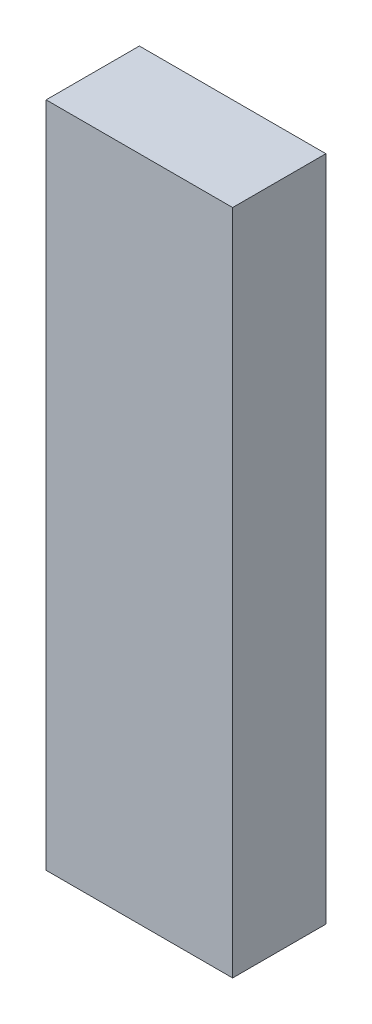
ISO-10303-21;
HEADER;
FILE_DESCRIPTION(('STEP AP214'),'2;1');
FILE_NAME('part.step','',(''),(''),'','','');
FILE_SCHEMA(('AUTOMOTIVE_DESIGN { 1 0 10303 214 1 1 1 1 }'));
ENDSEC;
DATA;
#1=APPLICATION_CONTEXT('core data for automotive mechanical design processes');
#2=APPLICATION_PROTOCOL_DEFINITION('international standard','automotive_design',2000,#1);
#3=PRODUCT_CONTEXT('',#1,'mechanical');
#4=PRODUCT('Part','Part','',(#3));
#5=PRODUCT_RELATED_PRODUCT_CATEGORY('part','',(#4));
#6=PRODUCT_DEFINITION_FORMATION('','',#4);
#7=PRODUCT_DEFINITION_CONTEXT('part definition',#1,'design');
#8=PRODUCT_DEFINITION('design','',#6,#7);
#9=PRODUCT_DEFINITION_SHAPE('','',#8);
#10=(LENGTH_UNIT() NAMED_UNIT(*) SI_UNIT(.MILLI.,.METRE.));
#11=(NAMED_UNIT(*) PLANE_ANGLE_UNIT() SI_UNIT($,.RADIAN.));
#12=(NAMED_UNIT(*) SI_UNIT($,.STERADIAN.) SOLID_ANGLE_UNIT());
#13=UNCERTAINTY_MEASURE_WITH_UNIT(LENGTH_MEASURE(1.E-05),#10,'distance_accuracy_value','');
#14=(GEOMETRIC_REPRESENTATION_CONTEXT(3) GLOBAL_UNCERTAINTY_ASSIGNED_CONTEXT((#13)) GLOBAL_UNIT_ASSIGNED_CONTEXT((#10,
#11,#12)) REPRESENTATION_CONTEXT('',''));
#15=CARTESIAN_POINT('',(0.,0.,0.));
#16=DIRECTION('',(0.,0.,1.));
#17=DIRECTION('',(1.,0.,0.));
#18=AXIS2_PLACEMENT_3D('',#15,#16,#17);
#19=CARTESIAN_POINT('',(-50.8,363.474,-25.4));
#20=DIRECTION('',(1.,0.,0.));
#21=DIRECTION('',(0.,0.,-1.));
#22=AXIS2_PLACEMENT_3D('',#19,#20,#21);
#23=PLANE('',#22);
#24=DIRECTION('',(0.,0.,1.));
#25=VECTOR('',#24,1.);
#26=CARTESIAN_POINT('',(-50.8,0.,-25.4));
#27=LINE('',#26,#25);
#28=CARTESIAN_POINT('',(-50.8,0.,-25.4));
#29=VERTEX_POINT('',#28);
#30=CARTESIAN_POINT('',(-50.8,0.,25.4));
#31=VERTEX_POINT('',#30);
#32=EDGE_CURVE('E94',#29,#31,#27,.T.);
#33=ORIENTED_EDGE('',*,*,#32,.T.);
#34=DIRECTION('',(0.,-1.,0.));
#35=VECTOR('',#34,1.);
#36=CARTESIAN_POINT('',(-50.8,363.474,25.4));
#37=LINE('',#36,#35);
#38=CARTESIAN_POINT('',(-50.8,363.474,25.4));
#39=VERTEX_POINT('',#38);
#40=EDGE_CURVE('E11',#39,#31,#37,.T.);
#41=ORIENTED_EDGE('',*,*,#40,.F.);
#42=DIRECTION('',(0.,0.,1.));
#43=VECTOR('',#42,1.);
#44=CARTESIAN_POINT('',(-50.8,363.474,-25.4));
#45=LINE('',#44,#43);
#46=CARTESIAN_POINT('',(-50.8,363.474,-25.4));
#47=VERTEX_POINT('',#46);
#48=EDGE_CURVE('E82',#47,#39,#45,.T.);
#49=ORIENTED_EDGE('',*,*,#48,.F.);
#50=DIRECTION('',(0.,-1.,0.));
#51=VECTOR('',#50,1.);
#52=CARTESIAN_POINT('',(-50.8,363.474,-25.4));
#53=LINE('',#52,#51);
#54=EDGE_CURVE('E90',#47,#29,#53,.T.);
#55=ORIENTED_EDGE('',*,*,#54,.T.);
#56=EDGE_LOOP('',(#33,#41,#49,#55));
#57=FACE_BOUND('',#56,.T.);
#58=ADVANCED_FACE('F31',(#57),#23,.F.);
#59=CARTESIAN_POINT('',(-50.8,363.474,25.4));
#60=DIRECTION('',(0.,0.,-1.));
#61=DIRECTION('',(-1.,0.,0.));
#62=AXIS2_PLACEMENT_3D('',#59,#60,#61);
#63=PLANE('',#62);
#64=DIRECTION('',(1.,0.,0.));
#65=VECTOR('',#64,1.);
#66=CARTESIAN_POINT('',(-50.8,0.,25.4));
#67=LINE('',#66,#65);
#68=CARTESIAN_POINT('',(50.8,0.,25.4));
#69=VERTEX_POINT('',#68);
#70=EDGE_CURVE('E86',#31,#69,#67,.T.);
#71=ORIENTED_EDGE('',*,*,#70,.T.);
#72=DIRECTION('',(0.,-1.,0.));
#73=VECTOR('',#72,1.);
#74=CARTESIAN_POINT('',(50.8,363.474,25.4));
#75=LINE('',#74,#73);
#76=CARTESIAN_POINT('',(50.8,363.474,25.4));
#77=VERTEX_POINT('',#76);
#78=EDGE_CURVE('E39',#77,#69,#75,.T.);
#79=ORIENTED_EDGE('',*,*,#78,.F.);
#80=DIRECTION('',(1.,0.,0.));
#81=VECTOR('',#80,1.);
#82=CARTESIAN_POINT('',(-50.8,363.474,25.4));
#83=LINE('',#82,#81);
#84=EDGE_CURVE('E77',#39,#77,#83,.T.);
#85=ORIENTED_EDGE('',*,*,#84,.F.);
#86=ORIENTED_EDGE('',*,*,#40,.T.);
#87=EDGE_LOOP('',(#71,#79,#85,#86));
#88=FACE_BOUND('',#87,.T.);
#89=ADVANCED_FACE('F85',(#88),#63,.F.);
#90=CARTESIAN_POINT('',(50.8,363.474,-25.4));
#91=DIRECTION('',(-1.,0.,0.));
#92=DIRECTION('',(0.,0.,1.));
#93=AXIS2_PLACEMENT_3D('',#90,#91,#92);
#94=PLANE('',#93);
#95=DIRECTION('',(0.,0.,-1.));
#96=VECTOR('',#95,1.);
#97=CARTESIAN_POINT('',(50.8,0.,-25.4));
#98=LINE('',#97,#96);
#99=CARTESIAN_POINT('',(50.8,0.,-25.4));
#100=VERTEX_POINT('',#99);
#101=EDGE_CURVE('E64',#69,#100,#98,.T.);
#102=ORIENTED_EDGE('',*,*,#101,.T.);
#103=DIRECTION('',(0.,-1.,0.));
#104=VECTOR('',#103,1.);
#105=CARTESIAN_POINT('',(50.8,363.474,-25.4));
#106=LINE('',#105,#104);
#107=CARTESIAN_POINT('',(50.8,363.474,-25.4));
#108=VERTEX_POINT('',#107);
#109=EDGE_CURVE('E87',#108,#100,#106,.T.);
#110=ORIENTED_EDGE('',*,*,#109,.F.);
#111=DIRECTION('',(0.,0.,-1.));
#112=VECTOR('',#111,1.);
#113=CARTESIAN_POINT('',(50.8,363.474,-25.4));
#114=LINE('',#113,#112);
#115=EDGE_CURVE('E80',#77,#108,#114,.T.);
#116=ORIENTED_EDGE('',*,*,#115,.F.);
#117=ORIENTED_EDGE('',*,*,#78,.T.);
#118=EDGE_LOOP('',(#102,#110,#116,#117));
#119=FACE_BOUND('',#118,.T.);
#120=ADVANCED_FACE('F88',(#119),#94,.F.);
#121=CARTESIAN_POINT('',(-50.8,363.474,-25.4));
#122=DIRECTION('',(0.,0.,1.));
#123=DIRECTION('',(1.,0.,0.));
#124=AXIS2_PLACEMENT_3D('',#121,#122,#123);
#125=PLANE('',#124);
#126=DIRECTION('',(-1.,0.,0.));
#127=VECTOR('',#126,1.);
#128=CARTESIAN_POINT('',(-50.8,0.,-25.4));
#129=LINE('',#128,#127);
#130=EDGE_CURVE('E70',#100,#29,#129,.T.);
#131=ORIENTED_EDGE('',*,*,#130,.T.);
#132=ORIENTED_EDGE('',*,*,#54,.F.);
#133=DIRECTION('',(-1.,0.,0.));
#134=VECTOR('',#133,1.);
#135=CARTESIAN_POINT('',(-50.8,363.474,-25.4));
#136=LINE('',#135,#134);
#137=EDGE_CURVE('E47',#108,#47,#136,.T.);
#138=ORIENTED_EDGE('',*,*,#137,.F.);
#139=ORIENTED_EDGE('',*,*,#109,.T.);
#140=EDGE_LOOP('',(#131,#132,#138,#139));
#141=FACE_BOUND('',#140,.T.);
#142=ADVANCED_FACE('F101',(#141),#125,.F.);
#143=CARTESIAN_POINT('',(-50.8,363.474,25.4));
#144=DIRECTION('',(0.,1.,0.));
#145=DIRECTION('',(0.,0.,1.));
#146=AXIS2_PLACEMENT_3D('',#143,#144,#145);
#147=PLANE('',#146);
#148=ORIENTED_EDGE('',*,*,#48,.T.);
#149=ORIENTED_EDGE('',*,*,#84,.T.);
#150=ORIENTED_EDGE('',*,*,#115,.T.);
#151=ORIENTED_EDGE('',*,*,#137,.T.);
#152=EDGE_LOOP('',(#148,#149,#150,#151));
#153=FACE_BOUND('',#152,.T.);
#154=ADVANCED_FACE('F78',(#153),#147,.T.);
#155=CARTESIAN_POINT('',(-50.8,0.,25.4));
#156=DIRECTION('',(0.,1.,0.));
#157=DIRECTION('',(0.,0.,1.));
#158=AXIS2_PLACEMENT_3D('',#155,#156,#157);
#159=PLANE('',#158);
#160=ORIENTED_EDGE('',*,*,#32,.F.);
#161=ORIENTED_EDGE('',*,*,#130,.F.);
#162=ORIENTED_EDGE('',*,*,#101,.F.);
#163=ORIENTED_EDGE('',*,*,#70,.F.);
#164=EDGE_LOOP('',(#160,#161,#162,#163));
#165=FACE_BOUND('',#164,.T.);
#166=ADVANCED_FACE('F104',(#165),#159,.F.);
#167=CLOSED_SHELL('',(#58,#89,#120,#142,#154,#166));
#168=MANIFOLD_SOLID_BREP('B2',#167);
#169=ADVANCED_BREP_SHAPE_REPRESENTATION('',(#18,#168),#14);
#170=SHAPE_DEFINITION_REPRESENTATION(#9,#169);
ENDSEC;
END-ISO-10303-21;
